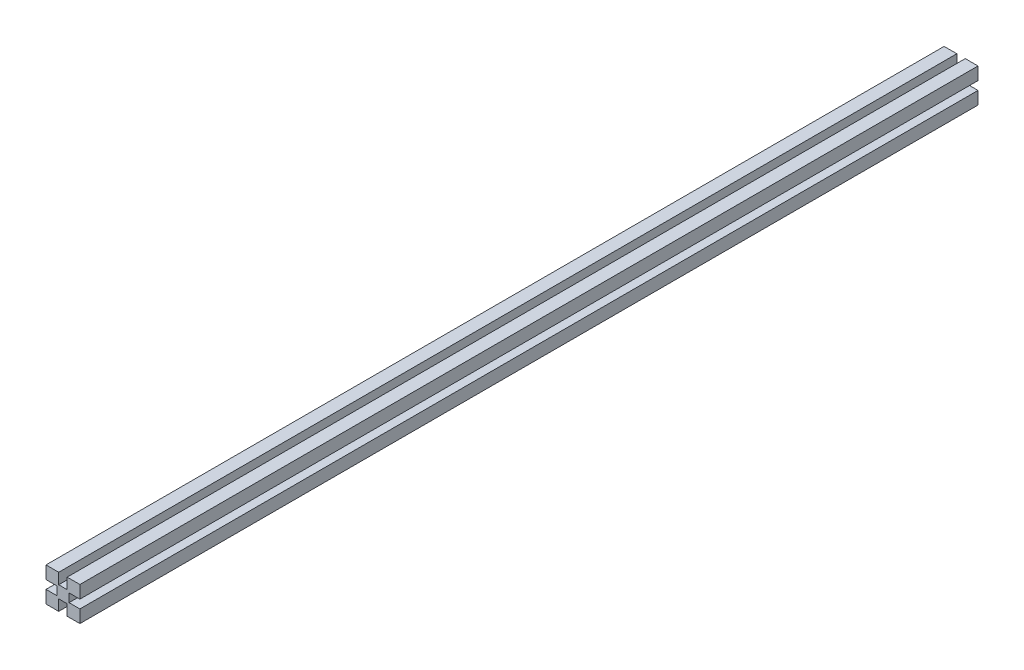
ISO-10303-21;
HEADER;
FILE_DESCRIPTION(('STEP AP214'),'2;1');
FILE_NAME('part.step','',(''),(''),'','','');
FILE_SCHEMA(('AUTOMOTIVE_DESIGN { 1 0 10303 214 1 1 1 1 }'));
ENDSEC;
DATA;
#1=APPLICATION_CONTEXT('core data for automotive mechanical design processes');
#2=APPLICATION_PROTOCOL_DEFINITION('international standard','automotive_design',2000,#1);
#3=PRODUCT_CONTEXT('',#1,'mechanical');
#4=PRODUCT('Part','Part','',(#3));
#5=PRODUCT_RELATED_PRODUCT_CATEGORY('part','',(#4));
#6=PRODUCT_DEFINITION_FORMATION('','',#4);
#7=PRODUCT_DEFINITION_CONTEXT('part definition',#1,'design');
#8=PRODUCT_DEFINITION('design','',#6,#7);
#9=PRODUCT_DEFINITION_SHAPE('','',#8);
#10=(LENGTH_UNIT() NAMED_UNIT(*) SI_UNIT(.MILLI.,.METRE.));
#11=(NAMED_UNIT(*) PLANE_ANGLE_UNIT() SI_UNIT($,.RADIAN.));
#12=(NAMED_UNIT(*) SI_UNIT($,.STERADIAN.) SOLID_ANGLE_UNIT());
#13=UNCERTAINTY_MEASURE_WITH_UNIT(LENGTH_MEASURE(1.E-05),#10,'distance_accuracy_value','');
#14=(GEOMETRIC_REPRESENTATION_CONTEXT(3) GLOBAL_UNCERTAINTY_ASSIGNED_CONTEXT((#13)) GLOBAL_UNIT_ASSIGNED_CONTEXT((#10,
#11,#12)) REPRESENTATION_CONTEXT('',''));
#15=CARTESIAN_POINT('',(0.,0.,0.));
#16=DIRECTION('',(0.,0.,1.));
#17=DIRECTION('',(1.,0.,0.));
#18=AXIS2_PLACEMENT_3D('',#15,#16,#17);
#19=CARTESIAN_POINT('',(-12.7,12.7,673.1));
#20=DIRECTION('',(0.,-1.,0.));
#21=DIRECTION('',(1.,0.,0.));
#22=AXIS2_PLACEMENT_3D('',#19,#20,#21);
#23=PLANE('',#22);
#24=DIRECTION('',(-1.,0.,0.));
#25=VECTOR('',#24,1.);
#26=CARTESIAN_POINT('',(-12.7,12.7,0.));
#27=LINE('',#26,#25);
#28=CARTESIAN_POINT('',(-3.175,12.7,0.));
#29=VERTEX_POINT('',#28);
#30=CARTESIAN_POINT('',(-12.7,12.7,0.));
#31=VERTEX_POINT('',#30);
#32=EDGE_CURVE('E212',#29,#31,#27,.T.);
#33=ORIENTED_EDGE('',*,*,#32,.T.);
#34=DIRECTION('',(0.,0.,-1.));
#35=VECTOR('',#34,1.);
#36=CARTESIAN_POINT('',(-12.7,12.7,673.1));
#37=LINE('',#36,#35);
#38=CARTESIAN_POINT('',(-12.7,12.7,673.1));
#39=VERTEX_POINT('',#38);
#40=EDGE_CURVE('E11',#39,#31,#37,.T.);
#41=ORIENTED_EDGE('',*,*,#40,.F.);
#42=DIRECTION('',(-1.,0.,0.));
#43=VECTOR('',#42,1.);
#44=CARTESIAN_POINT('',(-12.7,12.7,673.1));
#45=LINE('',#44,#43);
#46=CARTESIAN_POINT('',(-3.175,12.7,673.1));
#47=VERTEX_POINT('',#46);
#48=EDGE_CURVE('E270',#47,#39,#45,.T.);
#49=ORIENTED_EDGE('',*,*,#48,.F.);
#50=DIRECTION('',(0.,0.,-1.));
#51=VECTOR('',#50,1.);
#52=CARTESIAN_POINT('',(-3.175,12.7,673.1));
#53=LINE('',#52,#51);
#54=EDGE_CURVE('E208',#47,#29,#53,.T.);
#55=ORIENTED_EDGE('',*,*,#54,.T.);
#56=EDGE_LOOP('',(#33,#41,#49,#55));
#57=FACE_BOUND('',#56,.T.);
#58=ADVANCED_FACE('F39',(#57),#23,.F.);
#59=CARTESIAN_POINT('',(-12.7,12.7,673.1));
#60=DIRECTION('',(1.,0.,0.));
#61=DIRECTION('',(0.,0.,-1.));
#62=AXIS2_PLACEMENT_3D('',#59,#60,#61);
#63=PLANE('',#62);
#64=DIRECTION('',(0.,-1.,0.));
#65=VECTOR('',#64,1.);
#66=CARTESIAN_POINT('',(-12.7,12.7,0.));
#67=LINE('',#66,#65);
#68=CARTESIAN_POINT('',(-12.7,3.17500000000001,0.));
#69=VERTEX_POINT('',#68);
#70=EDGE_CURVE('E216',#31,#69,#67,.T.);
#71=ORIENTED_EDGE('',*,*,#70,.T.);
#72=DIRECTION('',(0.,0.,-1.));
#73=VECTOR('',#72,1.);
#74=CARTESIAN_POINT('',(-12.7,3.17500000000001,673.1));
#75=LINE('',#74,#73);
#76=CARTESIAN_POINT('',(-12.7,3.17500000000001,673.1));
#77=VERTEX_POINT('',#76);
#78=EDGE_CURVE('E48',#77,#69,#75,.T.);
#79=ORIENTED_EDGE('',*,*,#78,.F.);
#80=DIRECTION('',(0.,-1.,0.));
#81=VECTOR('',#80,1.);
#82=CARTESIAN_POINT('',(-12.7,12.7,673.1));
#83=LINE('',#82,#81);
#84=EDGE_CURVE('E135',#39,#77,#83,.T.);
#85=ORIENTED_EDGE('',*,*,#84,.F.);
#86=ORIENTED_EDGE('',*,*,#40,.T.);
#87=EDGE_LOOP('',(#71,#79,#85,#86));
#88=FACE_BOUND('',#87,.T.);
#89=ADVANCED_FACE('F420',(#88),#63,.F.);
#90=CARTESIAN_POINT('',(-12.7,3.17500000000001,673.1));
#91=DIRECTION('',(0.,1.,0.));
#92=DIRECTION('',(-1.,0.,0.));
#93=AXIS2_PLACEMENT_3D('',#90,#91,#92);
#94=PLANE('',#93);
#95=DIRECTION('',(1.,0.,0.));
#96=VECTOR('',#95,1.);
#97=CARTESIAN_POINT('',(-12.7,3.17500000000001,0.));
#98=LINE('',#97,#96);
#99=CARTESIAN_POINT('',(-4.572,3.17500000000001,0.));
#100=VERTEX_POINT('',#99);
#101=EDGE_CURVE('E219',#69,#100,#98,.T.);
#102=ORIENTED_EDGE('',*,*,#101,.T.);
#103=DIRECTION('',(0.,0.,-1.));
#104=VECTOR('',#103,1.);
#105=CARTESIAN_POINT('',(-4.572,3.17500000000001,673.1));
#106=LINE('',#105,#104);
#107=CARTESIAN_POINT('',(-4.572,3.17500000000001,673.1));
#108=VERTEX_POINT('',#107);
#109=EDGE_CURVE('E329',#108,#100,#106,.T.);
#110=ORIENTED_EDGE('',*,*,#109,.F.);
#111=DIRECTION('',(1.,0.,0.));
#112=VECTOR('',#111,1.);
#113=CARTESIAN_POINT('',(-12.7,3.17500000000001,673.1));
#114=LINE('',#113,#112);
#115=EDGE_CURVE('E339',#77,#108,#114,.T.);
#116=ORIENTED_EDGE('',*,*,#115,.F.);
#117=ORIENTED_EDGE('',*,*,#78,.T.);
#118=EDGE_LOOP('',(#102,#110,#116,#117));
#119=FACE_BOUND('',#118,.T.);
#120=ADVANCED_FACE('F337',(#119),#94,.F.);
#121=CARTESIAN_POINT('',(-4.572,3.17500000000001,673.1));
#122=DIRECTION('',(1.,0.,0.));
#123=DIRECTION('',(0.,0.,-1.));
#124=AXIS2_PLACEMENT_3D('',#121,#122,#123);
#125=PLANE('',#124);
#126=DIRECTION('',(0.,-1.,0.));
#127=VECTOR('',#126,1.);
#128=CARTESIAN_POINT('',(-4.572,3.17500000000001,0.));
#129=LINE('',#128,#127);
#130=CARTESIAN_POINT('',(-4.572,-3.17500000000001,0.));
#131=VERTEX_POINT('',#130);
#132=EDGE_CURVE('E222',#100,#131,#129,.T.);
#133=ORIENTED_EDGE('',*,*,#132,.T.);
#134=DIRECTION('',(0.,0.,-1.));
#135=VECTOR('',#134,1.);
#136=CARTESIAN_POINT('',(-4.572,-3.17500000000001,673.1));
#137=LINE('',#136,#135);
#138=CARTESIAN_POINT('',(-4.572,-3.17500000000001,673.1));
#139=VERTEX_POINT('',#138);
#140=EDGE_CURVE('E325',#139,#131,#137,.T.);
#141=ORIENTED_EDGE('',*,*,#140,.F.);
#142=DIRECTION('',(0.,-1.,0.));
#143=VECTOR('',#142,1.);
#144=CARTESIAN_POINT('',(-4.572,3.17500000000001,673.1));
#145=LINE('',#144,#143);
#146=EDGE_CURVE('E358',#108,#139,#145,.T.);
#147=ORIENTED_EDGE('',*,*,#146,.F.);
#148=ORIENTED_EDGE('',*,*,#109,.T.);
#149=EDGE_LOOP('',(#133,#141,#147,#148));
#150=FACE_BOUND('',#149,.T.);
#151=ADVANCED_FACE('F348',(#150),#125,.F.);
#152=CARTESIAN_POINT('',(-4.572,-3.17500000000001,673.1));
#153=DIRECTION('',(0.,-1.,0.));
#154=DIRECTION('',(1.,0.,0.));
#155=AXIS2_PLACEMENT_3D('',#152,#153,#154);
#156=PLANE('',#155);
#157=DIRECTION('',(-1.,0.,0.));
#158=VECTOR('',#157,1.);
#159=CARTESIAN_POINT('',(-4.572,-3.17500000000001,0.));
#160=LINE('',#159,#158);
#161=CARTESIAN_POINT('',(-12.7,-3.17500000000001,0.));
#162=VERTEX_POINT('',#161);
#163=EDGE_CURVE('E225',#131,#162,#160,.T.);
#164=ORIENTED_EDGE('',*,*,#163,.T.);
#165=DIRECTION('',(0.,0.,-1.));
#166=VECTOR('',#165,1.);
#167=CARTESIAN_POINT('',(-12.7,-3.17500000000001,673.1));
#168=LINE('',#167,#166);
#169=CARTESIAN_POINT('',(-12.7,-3.17500000000001,673.1));
#170=VERTEX_POINT('',#169);
#171=EDGE_CURVE('E321',#170,#162,#168,.T.);
#172=ORIENTED_EDGE('',*,*,#171,.F.);
#173=DIRECTION('',(-1.,0.,0.));
#174=VECTOR('',#173,1.);
#175=CARTESIAN_POINT('',(-4.572,-3.17500000000001,673.1));
#176=LINE('',#175,#174);
#177=EDGE_CURVE('E354',#139,#170,#176,.T.);
#178=ORIENTED_EDGE('',*,*,#177,.F.);
#179=ORIENTED_EDGE('',*,*,#140,.T.);
#180=EDGE_LOOP('',(#164,#172,#178,#179));
#181=FACE_BOUND('',#180,.T.);
#182=ADVANCED_FACE('F352',(#181),#156,.F.);
#183=CARTESIAN_POINT('',(-12.7,-3.17500000000001,673.1));
#184=DIRECTION('',(1.,0.,0.));
#185=DIRECTION('',(0.,0.,-1.));
#186=AXIS2_PLACEMENT_3D('',#183,#184,#185);
#187=PLANE('',#186);
#188=DIRECTION('',(0.,-1.,0.));
#189=VECTOR('',#188,1.);
#190=CARTESIAN_POINT('',(-12.7,-3.17500000000001,0.));
#191=LINE('',#190,#189);
#192=CARTESIAN_POINT('',(-12.7,-12.7,0.));
#193=VERTEX_POINT('',#192);
#194=EDGE_CURVE('E228',#162,#193,#191,.T.);
#195=ORIENTED_EDGE('',*,*,#194,.T.);
#196=DIRECTION('',(0.,0.,-1.));
#197=VECTOR('',#196,1.);
#198=CARTESIAN_POINT('',(-12.7,-12.7,673.1));
#199=LINE('',#198,#197);
#200=CARTESIAN_POINT('',(-12.7,-12.7,673.1));
#201=VERTEX_POINT('',#200);
#202=EDGE_CURVE('E317',#201,#193,#199,.T.);
#203=ORIENTED_EDGE('',*,*,#202,.F.);
#204=DIRECTION('',(0.,-1.,0.));
#205=VECTOR('',#204,1.);
#206=CARTESIAN_POINT('',(-12.7,-3.17500000000001,673.1));
#207=LINE('',#206,#205);
#208=EDGE_CURVE('E357',#170,#201,#207,.T.);
#209=ORIENTED_EDGE('',*,*,#208,.F.);
#210=ORIENTED_EDGE('',*,*,#171,.T.);
#211=EDGE_LOOP('',(#195,#203,#209,#210));
#212=FACE_BOUND('',#211,.T.);
#213=ADVANCED_FACE('F433',(#212),#187,.F.);
#214=CARTESIAN_POINT('',(-12.7,-12.7,673.1));
#215=DIRECTION('',(0.,1.,0.));
#216=DIRECTION('',(-1.,0.,0.));
#217=AXIS2_PLACEMENT_3D('',#214,#215,#216);
#218=PLANE('',#217);
#219=DIRECTION('',(1.,0.,0.));
#220=VECTOR('',#219,1.);
#221=CARTESIAN_POINT('',(-12.7,-12.7,0.));
#222=LINE('',#221,#220);
#223=CARTESIAN_POINT('',(-3.175,-12.7,0.));
#224=VERTEX_POINT('',#223);
#225=EDGE_CURVE('E231',#193,#224,#222,.T.);
#226=ORIENTED_EDGE('',*,*,#225,.T.);
#227=DIRECTION('',(0.,0.,-1.));
#228=VECTOR('',#227,1.);
#229=CARTESIAN_POINT('',(-3.175,-12.7,673.1));
#230=LINE('',#229,#228);
#231=CARTESIAN_POINT('',(-3.175,-12.7,673.1));
#232=VERTEX_POINT('',#231);
#233=EDGE_CURVE('E313',#232,#224,#230,.T.);
#234=ORIENTED_EDGE('',*,*,#233,.F.);
#235=DIRECTION('',(1.,0.,0.));
#236=VECTOR('',#235,1.);
#237=CARTESIAN_POINT('',(-12.7,-12.7,673.1));
#238=LINE('',#237,#236);
#239=EDGE_CURVE('E362',#201,#232,#238,.T.);
#240=ORIENTED_EDGE('',*,*,#239,.F.);
#241=ORIENTED_EDGE('',*,*,#202,.T.);
#242=EDGE_LOOP('',(#226,#234,#240,#241));
#243=FACE_BOUND('',#242,.T.);
#244=ADVANCED_FACE('F436',(#243),#218,.F.);
#245=CARTESIAN_POINT('',(-3.175,-12.7,673.1));
#246=DIRECTION('',(-1.,0.,0.));
#247=DIRECTION('',(0.,-1.,0.));
#248=AXIS2_PLACEMENT_3D('',#245,#246,#247);
#249=PLANE('',#248);
#250=DIRECTION('',(0.,1.,0.));
#251=VECTOR('',#250,1.);
#252=CARTESIAN_POINT('',(-3.175,-12.7,0.));
#253=LINE('',#252,#251);
#254=CARTESIAN_POINT('',(-3.175,-4.572,0.));
#255=VERTEX_POINT('',#254);
#256=EDGE_CURVE('E234',#224,#255,#253,.T.);
#257=ORIENTED_EDGE('',*,*,#256,.T.);
#258=DIRECTION('',(0.,0.,-1.));
#259=VECTOR('',#258,1.);
#260=CARTESIAN_POINT('',(-3.175,-4.572,673.1));
#261=LINE('',#260,#259);
#262=CARTESIAN_POINT('',(-3.175,-4.572,673.1));
#263=VERTEX_POINT('',#262);
#264=EDGE_CURVE('E309',#263,#255,#261,.T.);
#265=ORIENTED_EDGE('',*,*,#264,.F.);
#266=DIRECTION('',(0.,1.,0.));
#267=VECTOR('',#266,1.);
#268=CARTESIAN_POINT('',(-3.175,-12.7,673.1));
#269=LINE('',#268,#267);
#270=EDGE_CURVE('E369',#232,#263,#269,.T.);
#271=ORIENTED_EDGE('',*,*,#270,.F.);
#272=ORIENTED_EDGE('',*,*,#233,.T.);
#273=EDGE_LOOP('',(#257,#265,#271,#272));
#274=FACE_BOUND('',#273,.T.);
#275=ADVANCED_FACE('F440',(#274),#249,.F.);
#276=CARTESIAN_POINT('',(-3.175,-4.572,673.1));
#277=DIRECTION('',(0.,1.,0.));
#278=DIRECTION('',(0.,0.,1.));
#279=AXIS2_PLACEMENT_3D('',#276,#277,#278);
#280=PLANE('',#279);
#281=DIRECTION('',(1.,0.,0.));
#282=VECTOR('',#281,1.);
#283=CARTESIAN_POINT('',(-3.175,-4.572,0.));
#284=LINE('',#283,#282);
#285=CARTESIAN_POINT('',(3.175,-4.572,0.));
#286=VERTEX_POINT('',#285);
#287=EDGE_CURVE('E237',#255,#286,#284,.T.);
#288=ORIENTED_EDGE('',*,*,#287,.T.);
#289=DIRECTION('',(0.,0.,-1.));
#290=VECTOR('',#289,1.);
#291=CARTESIAN_POINT('',(3.175,-4.572,673.1));
#292=LINE('',#291,#290);
#293=CARTESIAN_POINT('',(3.175,-4.572,673.1));
#294=VERTEX_POINT('',#293);
#295=EDGE_CURVE('E305',#294,#286,#292,.T.);
#296=ORIENTED_EDGE('',*,*,#295,.F.);
#297=DIRECTION('',(1.,0.,0.));
#298=VECTOR('',#297,1.);
#299=CARTESIAN_POINT('',(-3.175,-4.572,673.1));
#300=LINE('',#299,#298);
#301=EDGE_CURVE('E372',#263,#294,#300,.T.);
#302=ORIENTED_EDGE('',*,*,#301,.F.);
#303=ORIENTED_EDGE('',*,*,#264,.T.);
#304=EDGE_LOOP('',(#288,#296,#302,#303));
#305=FACE_BOUND('',#304,.T.);
#306=ADVANCED_FACE('F444',(#305),#280,.F.);
#307=CARTESIAN_POINT('',(3.175,-4.572,673.1));
#308=DIRECTION('',(1.,0.,0.));
#309=DIRECTION('',(0.,1.,0.));
#310=AXIS2_PLACEMENT_3D('',#307,#308,#309);
#311=PLANE('',#310);
#312=DIRECTION('',(0.,-1.,0.));
#313=VECTOR('',#312,1.);
#314=CARTESIAN_POINT('',(3.175,-4.572,0.));
#315=LINE('',#314,#313);
#316=CARTESIAN_POINT('',(3.175,-12.7,0.));
#317=VERTEX_POINT('',#316);
#318=EDGE_CURVE('E240',#286,#317,#315,.T.);
#319=ORIENTED_EDGE('',*,*,#318,.T.);
#320=DIRECTION('',(0.,0.,-1.));
#321=VECTOR('',#320,1.);
#322=CARTESIAN_POINT('',(3.175,-12.7,673.1));
#323=LINE('',#322,#321);
#324=CARTESIAN_POINT('',(3.175,-12.7,673.1));
#325=VERTEX_POINT('',#324);
#326=EDGE_CURVE('E301',#325,#317,#323,.T.);
#327=ORIENTED_EDGE('',*,*,#326,.F.);
#328=DIRECTION('',(0.,-1.,0.));
#329=VECTOR('',#328,1.);
#330=CARTESIAN_POINT('',(3.175,-4.572,673.1));
#331=LINE('',#330,#329);
#332=EDGE_CURVE('E375',#294,#325,#331,.T.);
#333=ORIENTED_EDGE('',*,*,#332,.F.);
#334=ORIENTED_EDGE('',*,*,#295,.T.);
#335=EDGE_LOOP('',(#319,#327,#333,#334));
#336=FACE_BOUND('',#335,.T.);
#337=ADVANCED_FACE('F448',(#336),#311,.F.);
#338=CARTESIAN_POINT('',(3.175,-12.7,673.1));
#339=DIRECTION('',(0.,1.,0.));
#340=DIRECTION('',(-1.,0.,0.));
#341=AXIS2_PLACEMENT_3D('',#338,#339,#340);
#342=PLANE('',#341);
#343=DIRECTION('',(1.,0.,0.));
#344=VECTOR('',#343,1.);
#345=CARTESIAN_POINT('',(3.175,-12.7,0.));
#346=LINE('',#345,#344);
#347=CARTESIAN_POINT('',(12.7,-12.7,0.));
#348=VERTEX_POINT('',#347);
#349=EDGE_CURVE('E243',#317,#348,#346,.T.);
#350=ORIENTED_EDGE('',*,*,#349,.T.);
#351=DIRECTION('',(0.,0.,-1.));
#352=VECTOR('',#351,1.);
#353=CARTESIAN_POINT('',(12.7,-12.7,673.1));
#354=LINE('',#353,#352);
#355=CARTESIAN_POINT('',(12.7,-12.7,673.1));
#356=VERTEX_POINT('',#355);
#357=EDGE_CURVE('E297',#356,#348,#354,.T.);
#358=ORIENTED_EDGE('',*,*,#357,.F.);
#359=DIRECTION('',(1.,0.,0.));
#360=VECTOR('',#359,1.);
#361=CARTESIAN_POINT('',(3.175,-12.7,673.1));
#362=LINE('',#361,#360);
#363=EDGE_CURVE('E378',#325,#356,#362,.T.);
#364=ORIENTED_EDGE('',*,*,#363,.F.);
#365=ORIENTED_EDGE('',*,*,#326,.T.);
#366=EDGE_LOOP('',(#350,#358,#364,#365));
#367=FACE_BOUND('',#366,.T.);
#368=ADVANCED_FACE('F452',(#367),#342,.F.);
#369=CARTESIAN_POINT('',(12.7,-12.7,673.1));
#370=DIRECTION('',(-1.,0.,0.));
#371=DIRECTION('',(0.,0.,1.));
#372=AXIS2_PLACEMENT_3D('',#369,#370,#371);
#373=PLANE('',#372);
#374=DIRECTION('',(0.,1.,0.));
#375=VECTOR('',#374,1.);
#376=CARTESIAN_POINT('',(12.7,-12.7,0.));
#377=LINE('',#376,#375);
#378=CARTESIAN_POINT('',(12.7,-3.175,0.));
#379=VERTEX_POINT('',#378);
#380=EDGE_CURVE('E246',#348,#379,#377,.T.);
#381=ORIENTED_EDGE('',*,*,#380,.T.);
#382=DIRECTION('',(0.,0.,-1.));
#383=VECTOR('',#382,1.);
#384=CARTESIAN_POINT('',(12.7,-3.175,673.1));
#385=LINE('',#384,#383);
#386=CARTESIAN_POINT('',(12.7,-3.175,673.1));
#387=VERTEX_POINT('',#386);
#388=EDGE_CURVE('E293',#387,#379,#385,.T.);
#389=ORIENTED_EDGE('',*,*,#388,.F.);
#390=DIRECTION('',(0.,1.,0.));
#391=VECTOR('',#390,1.);
#392=CARTESIAN_POINT('',(12.7,-12.7,673.1));
#393=LINE('',#392,#391);
#394=EDGE_CURVE('E381',#356,#387,#393,.T.);
#395=ORIENTED_EDGE('',*,*,#394,.F.);
#396=ORIENTED_EDGE('',*,*,#357,.T.);
#397=EDGE_LOOP('',(#381,#389,#395,#396));
#398=FACE_BOUND('',#397,.T.);
#399=ADVANCED_FACE('F456',(#398),#373,.F.);
#400=CARTESIAN_POINT('',(12.7,-3.175,673.1));
#401=DIRECTION('',(0.,-1.,0.));
#402=DIRECTION('',(1.,0.,0.));
#403=AXIS2_PLACEMENT_3D('',#400,#401,#402);
#404=PLANE('',#403);
#405=DIRECTION('',(-1.,0.,0.));
#406=VECTOR('',#405,1.);
#407=CARTESIAN_POINT('',(12.7,-3.175,0.));
#408=LINE('',#407,#406);
#409=CARTESIAN_POINT('',(4.572,-3.175,0.));
#410=VERTEX_POINT('',#409);
#411=EDGE_CURVE('E249',#379,#410,#408,.T.);
#412=ORIENTED_EDGE('',*,*,#411,.T.);
#413=DIRECTION('',(0.,0.,-1.));
#414=VECTOR('',#413,1.);
#415=CARTESIAN_POINT('',(4.572,-3.175,673.1));
#416=LINE('',#415,#414);
#417=CARTESIAN_POINT('',(4.572,-3.175,673.1));
#418=VERTEX_POINT('',#417);
#419=EDGE_CURVE('E289',#418,#410,#416,.T.);
#420=ORIENTED_EDGE('',*,*,#419,.F.);
#421=DIRECTION('',(-1.,0.,0.));
#422=VECTOR('',#421,1.);
#423=CARTESIAN_POINT('',(12.7,-3.175,673.1));
#424=LINE('',#423,#422);
#425=EDGE_CURVE('E384',#387,#418,#424,.T.);
#426=ORIENTED_EDGE('',*,*,#425,.F.);
#427=ORIENTED_EDGE('',*,*,#388,.T.);
#428=EDGE_LOOP('',(#412,#420,#426,#427));
#429=FACE_BOUND('',#428,.T.);
#430=ADVANCED_FACE('F460',(#429),#404,.F.);
#431=CARTESIAN_POINT('',(4.572,-3.175,673.1));
#432=DIRECTION('',(-1.,0.,0.));
#433=DIRECTION('',(0.,0.,1.));
#434=AXIS2_PLACEMENT_3D('',#431,#432,#433);
#435=PLANE('',#434);
#436=DIRECTION('',(0.,1.,0.));
#437=VECTOR('',#436,1.);
#438=CARTESIAN_POINT('',(4.572,-3.175,0.));
#439=LINE('',#438,#437);
#440=CARTESIAN_POINT('',(4.572,3.175,0.));
#441=VERTEX_POINT('',#440);
#442=EDGE_CURVE('E252',#410,#441,#439,.T.);
#443=ORIENTED_EDGE('',*,*,#442,.T.);
#444=DIRECTION('',(0.,0.,-1.));
#445=VECTOR('',#444,1.);
#446=CARTESIAN_POINT('',(4.572,3.175,673.1));
#447=LINE('',#446,#445);
#448=CARTESIAN_POINT('',(4.572,3.175,673.1));
#449=VERTEX_POINT('',#448);
#450=EDGE_CURVE('E285',#449,#441,#447,.T.);
#451=ORIENTED_EDGE('',*,*,#450,.F.);
#452=DIRECTION('',(0.,1.,0.));
#453=VECTOR('',#452,1.);
#454=CARTESIAN_POINT('',(4.572,-3.175,673.1));
#455=LINE('',#454,#453);
#456=EDGE_CURVE('E387',#418,#449,#455,.T.);
#457=ORIENTED_EDGE('',*,*,#456,.F.);
#458=ORIENTED_EDGE('',*,*,#419,.T.);
#459=EDGE_LOOP('',(#443,#451,#457,#458));
#460=FACE_BOUND('',#459,.T.);
#461=ADVANCED_FACE('F464',(#460),#435,.F.);
#462=CARTESIAN_POINT('',(4.572,3.175,673.1));
#463=DIRECTION('',(0.,1.,0.));
#464=DIRECTION('',(-1.,0.,0.));
#465=AXIS2_PLACEMENT_3D('',#462,#463,#464);
#466=PLANE('',#465);
#467=DIRECTION('',(1.,0.,0.));
#468=VECTOR('',#467,1.);
#469=CARTESIAN_POINT('',(4.572,3.175,0.));
#470=LINE('',#469,#468);
#471=CARTESIAN_POINT('',(12.7,3.175,0.));
#472=VERTEX_POINT('',#471);
#473=EDGE_CURVE('E255',#441,#472,#470,.T.);
#474=ORIENTED_EDGE('',*,*,#473,.T.);
#475=DIRECTION('',(0.,0.,-1.));
#476=VECTOR('',#475,1.);
#477=CARTESIAN_POINT('',(12.7,3.175,673.1));
#478=LINE('',#477,#476);
#479=CARTESIAN_POINT('',(12.7,3.175,673.1));
#480=VERTEX_POINT('',#479);
#481=EDGE_CURVE('E281',#480,#472,#478,.T.);
#482=ORIENTED_EDGE('',*,*,#481,.F.);
#483=DIRECTION('',(1.,0.,0.));
#484=VECTOR('',#483,1.);
#485=CARTESIAN_POINT('',(4.572,3.175,673.1));
#486=LINE('',#485,#484);
#487=EDGE_CURVE('E390',#449,#480,#486,.T.);
#488=ORIENTED_EDGE('',*,*,#487,.F.);
#489=ORIENTED_EDGE('',*,*,#450,.T.);
#490=EDGE_LOOP('',(#474,#482,#488,#489));
#491=FACE_BOUND('',#490,.T.);
#492=ADVANCED_FACE('F468',(#491),#466,.F.);
#493=CARTESIAN_POINT('',(12.7,3.175,673.1));
#494=DIRECTION('',(-1.,0.,0.));
#495=DIRECTION('',(0.,0.,1.));
#496=AXIS2_PLACEMENT_3D('',#493,#494,#495);
#497=PLANE('',#496);
#498=DIRECTION('',(0.,1.,0.));
#499=VECTOR('',#498,1.);
#500=CARTESIAN_POINT('',(12.7,3.175,0.));
#501=LINE('',#500,#499);
#502=CARTESIAN_POINT('',(12.7,12.7,0.));
#503=VERTEX_POINT('',#502);
#504=EDGE_CURVE('E258',#472,#503,#501,.T.);
#505=ORIENTED_EDGE('',*,*,#504,.T.);
#506=DIRECTION('',(0.,0.,-1.));
#507=VECTOR('',#506,1.);
#508=CARTESIAN_POINT('',(12.7,12.7,673.1));
#509=LINE('',#508,#507);
#510=CARTESIAN_POINT('',(12.7,12.7,673.1));
#511=VERTEX_POINT('',#510);
#512=EDGE_CURVE('E277',#511,#503,#509,.T.);
#513=ORIENTED_EDGE('',*,*,#512,.F.);
#514=DIRECTION('',(0.,1.,0.));
#515=VECTOR('',#514,1.);
#516=CARTESIAN_POINT('',(12.7,3.175,673.1));
#517=LINE('',#516,#515);
#518=EDGE_CURVE('E393',#480,#511,#517,.T.);
#519=ORIENTED_EDGE('',*,*,#518,.F.);
#520=ORIENTED_EDGE('',*,*,#481,.T.);
#521=EDGE_LOOP('',(#505,#513,#519,#520));
#522=FACE_BOUND('',#521,.T.);
#523=ADVANCED_FACE('F401',(#522),#497,.F.);
#524=CARTESIAN_POINT('',(3.175,12.7,673.1));
#525=DIRECTION('',(0.,-1.,0.));
#526=DIRECTION('',(1.,0.,0.));
#527=AXIS2_PLACEMENT_3D('',#524,#525,#526);
#528=PLANE('',#527);
#529=DIRECTION('',(-1.,0.,0.));
#530=VECTOR('',#529,1.);
#531=CARTESIAN_POINT('',(3.175,12.7,0.));
#532=LINE('',#531,#530);
#533=CARTESIAN_POINT('',(3.175,12.7,0.));
#534=VERTEX_POINT('',#533);
#535=EDGE_CURVE('E261',#503,#534,#532,.T.);
#536=ORIENTED_EDGE('',*,*,#535,.T.);
#537=DIRECTION('',(0.,0.,-1.));
#538=VECTOR('',#537,1.);
#539=CARTESIAN_POINT('',(3.175,12.7,673.1));
#540=LINE('',#539,#538);
#541=CARTESIAN_POINT('',(3.175,12.7,673.1));
#542=VERTEX_POINT('',#541);
#543=EDGE_CURVE('E201',#542,#534,#540,.T.);
#544=ORIENTED_EDGE('',*,*,#543,.F.);
#545=DIRECTION('',(-1.,0.,0.));
#546=VECTOR('',#545,1.);
#547=CARTESIAN_POINT('',(3.175,12.7,673.1));
#548=LINE('',#547,#546);
#549=EDGE_CURVE('E190',#511,#542,#548,.T.);
#550=ORIENTED_EDGE('',*,*,#549,.F.);
#551=ORIENTED_EDGE('',*,*,#512,.T.);
#552=EDGE_LOOP('',(#536,#544,#550,#551));
#553=FACE_BOUND('',#552,.T.);
#554=ADVANCED_FACE('F405',(#553),#528,.F.);
#555=CARTESIAN_POINT('',(3.175,4.572,673.1));
#556=DIRECTION('',(1.,0.,0.));
#557=DIRECTION('',(0.,1.,0.));
#558=AXIS2_PLACEMENT_3D('',#555,#556,#557);
#559=PLANE('',#558);
#560=DIRECTION('',(0.,-1.,0.));
#561=VECTOR('',#560,1.);
#562=CARTESIAN_POINT('',(3.175,4.572,0.));
#563=LINE('',#562,#561);
#564=CARTESIAN_POINT('',(3.175,4.572,0.));
#565=VERTEX_POINT('',#564);
#566=EDGE_CURVE('E199',#534,#565,#563,.T.);
#567=ORIENTED_EDGE('',*,*,#566,.T.);
#568=DIRECTION('',(0.,0.,-1.));
#569=VECTOR('',#568,1.);
#570=CARTESIAN_POINT('',(3.175,4.572,673.1));
#571=LINE('',#570,#569);
#572=CARTESIAN_POINT('',(3.175,4.572,673.1));
#573=VERTEX_POINT('',#572);
#574=EDGE_CURVE('E196',#573,#565,#571,.T.);
#575=ORIENTED_EDGE('',*,*,#574,.F.);
#576=DIRECTION('',(0.,-1.,0.));
#577=VECTOR('',#576,1.);
#578=CARTESIAN_POINT('',(3.175,4.572,673.1));
#579=LINE('',#578,#577);
#580=EDGE_CURVE('E184',#542,#573,#579,.T.);
#581=ORIENTED_EDGE('',*,*,#580,.F.);
#582=ORIENTED_EDGE('',*,*,#543,.T.);
#583=EDGE_LOOP('',(#567,#575,#581,#582));
#584=FACE_BOUND('',#583,.T.);
#585=ADVANCED_FACE('F197',(#584),#559,.F.);
#586=CARTESIAN_POINT('',(-3.175,4.57199999999999,673.1));
#587=DIRECTION('',(0.,-1.,0.));
#588=DIRECTION('',(1.,0.,0.));
#589=AXIS2_PLACEMENT_3D('',#586,#587,#588);
#590=PLANE('',#589);
#591=DIRECTION('',(-1.,0.,0.));
#592=VECTOR('',#591,1.);
#593=CARTESIAN_POINT('',(-3.175,4.57199999999999,0.));
#594=LINE('',#593,#592);
#595=CARTESIAN_POINT('',(-3.175,4.57199999999999,0.));
#596=VERTEX_POINT('',#595);
#597=EDGE_CURVE('E121',#565,#596,#594,.T.);
#598=ORIENTED_EDGE('',*,*,#597,.T.);
#599=DIRECTION('',(0.,0.,-1.));
#600=VECTOR('',#599,1.);
#601=CARTESIAN_POINT('',(-3.175,4.57199999999999,673.1));
#602=LINE('',#601,#600);
#603=CARTESIAN_POINT('',(-3.175,4.57199999999999,673.1));
#604=VERTEX_POINT('',#603);
#605=EDGE_CURVE('E202',#604,#596,#602,.T.);
#606=ORIENTED_EDGE('',*,*,#605,.F.);
#607=DIRECTION('',(-1.,0.,0.));
#608=VECTOR('',#607,1.);
#609=CARTESIAN_POINT('',(-3.175,4.57199999999999,673.1));
#610=LINE('',#609,#608);
#611=EDGE_CURVE('E188',#573,#604,#610,.T.);
#612=ORIENTED_EDGE('',*,*,#611,.F.);
#613=ORIENTED_EDGE('',*,*,#574,.T.);
#614=EDGE_LOOP('',(#598,#606,#612,#613));
#615=FACE_BOUND('',#614,.T.);
#616=ADVANCED_FACE('F204',(#615),#590,.F.);
#617=CARTESIAN_POINT('',(-3.175,12.7,673.1));
#618=DIRECTION('',(-1.,0.,0.));
#619=DIRECTION('',(0.,-1.,0.));
#620=AXIS2_PLACEMENT_3D('',#617,#618,#619);
#621=PLANE('',#620);
#622=DIRECTION('',(0.,1.,0.));
#623=VECTOR('',#622,1.);
#624=CARTESIAN_POINT('',(-3.175,12.7,0.));
#625=LINE('',#624,#623);
#626=EDGE_CURVE('E127',#596,#29,#625,.T.);
#627=ORIENTED_EDGE('',*,*,#626,.T.);
#628=ORIENTED_EDGE('',*,*,#54,.F.);
#629=DIRECTION('',(0.,1.,0.));
#630=VECTOR('',#629,1.);
#631=CARTESIAN_POINT('',(-3.175,12.7,673.1));
#632=LINE('',#631,#630);
#633=EDGE_CURVE('E56',#604,#47,#632,.T.);
#634=ORIENTED_EDGE('',*,*,#633,.F.);
#635=ORIENTED_EDGE('',*,*,#605,.T.);
#636=EDGE_LOOP('',(#627,#628,#634,#635));
#637=FACE_BOUND('',#636,.T.);
#638=ADVANCED_FACE('F409',(#637),#621,.F.);
#639=CARTESIAN_POINT('',(0.,0.,673.1));
#640=DIRECTION('',(0.,0.,-1.));
#641=DIRECTION('',(-1.,0.,0.));
#642=AXIS2_PLACEMENT_3D('',#639,#640,#641);
#643=PLANE('',#642);
#644=ORIENTED_EDGE('',*,*,#48,.T.);
#645=ORIENTED_EDGE('',*,*,#84,.T.);
#646=ORIENTED_EDGE('',*,*,#115,.T.);
#647=ORIENTED_EDGE('',*,*,#146,.T.);
#648=ORIENTED_EDGE('',*,*,#177,.T.);
#649=ORIENTED_EDGE('',*,*,#208,.T.);
#650=ORIENTED_EDGE('',*,*,#239,.T.);
#651=ORIENTED_EDGE('',*,*,#270,.T.);
#652=ORIENTED_EDGE('',*,*,#301,.T.);
#653=ORIENTED_EDGE('',*,*,#332,.T.);
#654=ORIENTED_EDGE('',*,*,#363,.T.);
#655=ORIENTED_EDGE('',*,*,#394,.T.);
#656=ORIENTED_EDGE('',*,*,#425,.T.);
#657=ORIENTED_EDGE('',*,*,#456,.T.);
#658=ORIENTED_EDGE('',*,*,#487,.T.);
#659=ORIENTED_EDGE('',*,*,#518,.T.);
#660=ORIENTED_EDGE('',*,*,#549,.T.);
#661=ORIENTED_EDGE('',*,*,#580,.T.);
#662=ORIENTED_EDGE('',*,*,#611,.T.);
#663=ORIENTED_EDGE('',*,*,#633,.T.);
#664=EDGE_LOOP('',(#644,#645,#646,#647,#648,#649,#650,#651,#652,#653,#654,#655,#656,#657,#658,
#659,#660,#661,#662,#663));
#665=FACE_BOUND('',#664,.T.);
#666=ADVANCED_FACE('F186',(#665),#643,.F.);
#667=CARTESIAN_POINT('',(0.,0.,0.));
#668=DIRECTION('',(0.,0.,-1.));
#669=DIRECTION('',(-1.,0.,0.));
#670=AXIS2_PLACEMENT_3D('',#667,#668,#669);
#671=PLANE('',#670);
#672=ORIENTED_EDGE('',*,*,#32,.F.);
#673=ORIENTED_EDGE('',*,*,#626,.F.);
#674=ORIENTED_EDGE('',*,*,#597,.F.);
#675=ORIENTED_EDGE('',*,*,#566,.F.);
#676=ORIENTED_EDGE('',*,*,#535,.F.);
#677=ORIENTED_EDGE('',*,*,#504,.F.);
#678=ORIENTED_EDGE('',*,*,#473,.F.);
#679=ORIENTED_EDGE('',*,*,#442,.F.);
#680=ORIENTED_EDGE('',*,*,#411,.F.);
#681=ORIENTED_EDGE('',*,*,#380,.F.);
#682=ORIENTED_EDGE('',*,*,#349,.F.);
#683=ORIENTED_EDGE('',*,*,#318,.F.);
#684=ORIENTED_EDGE('',*,*,#287,.F.);
#685=ORIENTED_EDGE('',*,*,#256,.F.);
#686=ORIENTED_EDGE('',*,*,#225,.F.);
#687=ORIENTED_EDGE('',*,*,#194,.F.);
#688=ORIENTED_EDGE('',*,*,#163,.F.);
#689=ORIENTED_EDGE('',*,*,#132,.F.);
#690=ORIENTED_EDGE('',*,*,#101,.F.);
#691=ORIENTED_EDGE('',*,*,#70,.F.);
#692=EDGE_LOOP('',(#672,#673,#674,#675,#676,#677,#678,#679,#680,#681,#682,#683,#684,#685,#686,
#687,#688,#689,#690,#691));
#693=FACE_BOUND('',#692,.T.);
#694=ADVANCED_FACE('F343',(#693),#671,.T.);
#695=CLOSED_SHELL('',(#58,#89,#120,#151,#182,#213,#244,#275,#306,#337,#368,#399,#430,#461,#492,
#523,#554,#585,#616,#638,#666,#694));
#696=MANIFOLD_SOLID_BREP('B2',#695);
#697=ADVANCED_BREP_SHAPE_REPRESENTATION('',(#18,#696),#14);
#698=SHAPE_DEFINITION_REPRESENTATION(#9,#697);
ENDSEC;
END-ISO-10303-21;
